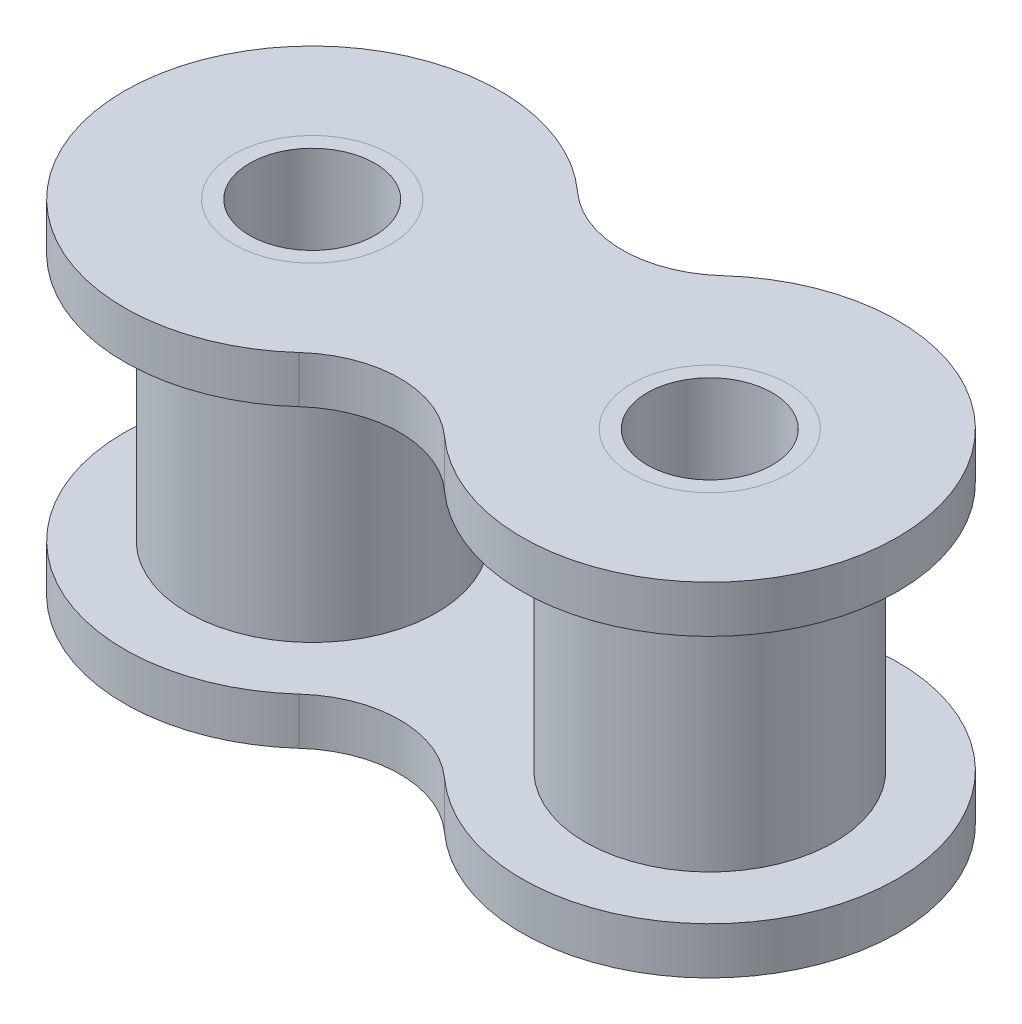
ISO-10303-21;
HEADER;
FILE_DESCRIPTION(('STEP AP214'),'2;1');
FILE_NAME('part.step','',(''),(''),'','','');
FILE_SCHEMA(('AUTOMOTIVE_DESIGN { 1 0 10303 214 1 1 1 1 }'));
ENDSEC;
DATA;
#1=APPLICATION_CONTEXT('core data for automotive mechanical design processes');
#2=APPLICATION_PROTOCOL_DEFINITION('international standard','automotive_design',2000,#1);
#3=PRODUCT_CONTEXT('',#1,'mechanical');
#4=PRODUCT('Part','Part','',(#3));
#5=PRODUCT_RELATED_PRODUCT_CATEGORY('part','',(#4));
#6=PRODUCT_DEFINITION_FORMATION('','',#4);
#7=PRODUCT_DEFINITION_CONTEXT('part definition',#1,'design');
#8=PRODUCT_DEFINITION('design','',#6,#7);
#9=PRODUCT_DEFINITION_SHAPE('','',#8);
#10=(LENGTH_UNIT() NAMED_UNIT(*) SI_UNIT(.MILLI.,.METRE.));
#11=(NAMED_UNIT(*) PLANE_ANGLE_UNIT() SI_UNIT($,.RADIAN.));
#12=(NAMED_UNIT(*) SI_UNIT($,.STERADIAN.) SOLID_ANGLE_UNIT());
#13=UNCERTAINTY_MEASURE_WITH_UNIT(LENGTH_MEASURE(1.E-05),#10,'distance_accuracy_value','');
#14=(GEOMETRIC_REPRESENTATION_CONTEXT(3) GLOBAL_UNCERTAINTY_ASSIGNED_CONTEXT((#13)) GLOBAL_UNIT_ASSIGNED_CONTEXT((#10,
#11,#12)) REPRESENTATION_CONTEXT('',''));
#15=CARTESIAN_POINT('',(0.,0.,0.));
#16=DIRECTION('',(0.,0.,1.));
#17=DIRECTION('',(1.,0.,0.));
#18=AXIS2_PLACEMENT_3D('',#15,#16,#17);
#19=CARTESIAN_POINT('',(8.35,5.475,0.));
#20=DIRECTION('',(0.,1.,0.));
#21=DIRECTION('',(0.,0.,1.));
#22=AXIS2_PLACEMENT_3D('',#19,#20,#21);
#23=PLANE('',#22);
#24=CARTESIAN_POINT('',(6.35,5.475,0.));
#25=DIRECTION('',(0.,1.,0.));
#26=DIRECTION('',(0.,0.,1.));
#27=AXIS2_PLACEMENT_3D('',#24,#25,#26);
#28=CIRCLE('',#27,2.5);
#29=CARTESIAN_POINT('',(6.35,5.475,2.5));
#30=VERTEX_POINT('',#29);
#31=EDGE_CURVE('E11',#30,#30,#28,.T.);
#32=ORIENTED_EDGE('',*,*,#31,.T.);
#33=EDGE_LOOP('',(#32));
#34=FACE_BOUND('',#33,.T.);
#35=CARTESIAN_POINT('',(6.35,5.475,0.));
#36=DIRECTION('',(0.,1.,0.));
#37=DIRECTION('',(0.,0.,1.));
#38=AXIS2_PLACEMENT_3D('',#35,#36,#37);
#39=CIRCLE('',#38,2.);
#40=CARTESIAN_POINT('',(6.35,5.475,2.));
#41=VERTEX_POINT('',#40);
#42=EDGE_CURVE('E60',#41,#41,#39,.T.);
#43=ORIENTED_EDGE('',*,*,#42,.F.);
#44=EDGE_LOOP('',(#43));
#45=FACE_BOUND('',#44,.T.);
#46=ADVANCED_FACE('F46',(#34,#45),#23,.T.);
#47=CARTESIAN_POINT('',(6.35,-5.475,0.));
#48=DIRECTION('',(0.,1.,0.));
#49=DIRECTION('',(0.,0.,1.));
#50=AXIS2_PLACEMENT_3D('',#47,#48,#49);
#51=CYLINDRICAL_SURFACE('',#50,2.5);
#52=CARTESIAN_POINT('',(6.35,-5.475,0.));
#53=DIRECTION('',(0.,1.,0.));
#54=DIRECTION('',(0.,0.,1.));
#55=AXIS2_PLACEMENT_3D('',#52,#53,#54);
#56=CIRCLE('',#55,2.5);
#57=CARTESIAN_POINT('',(6.35,-5.475,2.5));
#58=VERTEX_POINT('',#57);
#59=EDGE_CURVE('E52',#58,#58,#56,.T.);
#60=ORIENTED_EDGE('',*,*,#59,.T.);
#61=EDGE_LOOP('',(#60));
#62=FACE_BOUND('',#61,.T.);
#63=ORIENTED_EDGE('',*,*,#31,.F.);
#64=EDGE_LOOP('',(#63));
#65=FACE_BOUND('',#64,.T.);
#66=ADVANCED_FACE('F70',(#62,#65),#51,.T.);
#67=CARTESIAN_POINT('',(8.85,-5.475,0.));
#68=DIRECTION('',(0.,-1.,0.));
#69=DIRECTION('',(0.,0.,-1.));
#70=AXIS2_PLACEMENT_3D('',#67,#68,#69);
#71=PLANE('',#70);
#72=CARTESIAN_POINT('',(6.35,-5.475,0.));
#73=DIRECTION('',(0.,1.,0.));
#74=DIRECTION('',(0.,0.,1.));
#75=AXIS2_PLACEMENT_3D('',#72,#73,#74);
#76=CIRCLE('',#75,2.);
#77=CARTESIAN_POINT('',(6.35,-5.475,2.));
#78=VERTEX_POINT('',#77);
#79=EDGE_CURVE('E56',#78,#78,#76,.T.);
#80=ORIENTED_EDGE('',*,*,#79,.T.);
#81=EDGE_LOOP('',(#80));
#82=FACE_BOUND('',#81,.T.);
#83=ORIENTED_EDGE('',*,*,#59,.F.);
#84=EDGE_LOOP('',(#83));
#85=FACE_BOUND('',#84,.T.);
#86=ADVANCED_FACE('F74',(#82,#85),#71,.T.);
#87=CARTESIAN_POINT('',(6.35,-5.475,0.));
#88=DIRECTION('',(0.,1.,0.));
#89=DIRECTION('',(0.,0.,1.));
#90=AXIS2_PLACEMENT_3D('',#87,#88,#89);
#91=CYLINDRICAL_SURFACE('',#90,2.);
#92=ORIENTED_EDGE('',*,*,#42,.T.);
#93=EDGE_LOOP('',(#92));
#94=FACE_BOUND('',#93,.T.);
#95=ORIENTED_EDGE('',*,*,#79,.F.);
#96=EDGE_LOOP('',(#95));
#97=FACE_BOUND('',#96,.T.);
#98=ADVANCED_FACE('F66',(#94,#97),#91,.F.);
#99=CLOSED_SHELL('',(#46,#66,#86,#98));
#100=MANIFOLD_SOLID_BREP('B2',#99);
#101=CARTESIAN_POINT('',(-4.35,5.475,0.));
#102=DIRECTION('',(0.,1.,0.));
#103=DIRECTION('',(0.,0.,1.));
#104=AXIS2_PLACEMENT_3D('',#101,#102,#103);
#105=PLANE('',#104);
#106=CARTESIAN_POINT('',(-6.35,5.475,0.));
#107=DIRECTION('',(0.,1.,0.));
#108=DIRECTION('',(0.,0.,1.));
#109=AXIS2_PLACEMENT_3D('',#106,#107,#108);
#110=CIRCLE('',#109,2.5);
#111=CARTESIAN_POINT('',(-6.35,5.475,2.5));
#112=VERTEX_POINT('',#111);
#113=EDGE_CURVE('E45',#112,#112,#110,.T.);
#114=ORIENTED_EDGE('',*,*,#113,.T.);
#115=EDGE_LOOP('',(#114));
#116=FACE_BOUND('',#115,.T.);
#117=CARTESIAN_POINT('',(-6.35,5.475,0.));
#118=DIRECTION('',(0.,1.,0.));
#119=DIRECTION('',(0.,0.,1.));
#120=AXIS2_PLACEMENT_3D('',#117,#118,#119);
#121=CIRCLE('',#120,2.);
#122=CARTESIAN_POINT('',(-6.35,5.475,2.));
#123=VERTEX_POINT('',#122);
#124=EDGE_CURVE('E130',#123,#123,#121,.T.);
#125=ORIENTED_EDGE('',*,*,#124,.F.);
#126=EDGE_LOOP('',(#125));
#127=FACE_BOUND('',#126,.T.);
#128=ADVANCED_FACE('F116',(#116,#127),#105,.T.);
#129=CARTESIAN_POINT('',(-6.35,-5.475,0.));
#130=DIRECTION('',(0.,1.,0.));
#131=DIRECTION('',(0.,0.,1.));
#132=AXIS2_PLACEMENT_3D('',#129,#130,#131);
#133=CYLINDRICAL_SURFACE('',#132,2.5);
#134=CARTESIAN_POINT('',(-6.35,-5.475,0.));
#135=DIRECTION('',(0.,1.,0.));
#136=DIRECTION('',(0.,0.,1.));
#137=AXIS2_PLACEMENT_3D('',#134,#135,#136);
#138=CIRCLE('',#137,2.5);
#139=CARTESIAN_POINT('',(-6.35,-5.475,2.5));
#140=VERTEX_POINT('',#139);
#141=EDGE_CURVE('E122',#140,#140,#138,.T.);
#142=ORIENTED_EDGE('',*,*,#141,.T.);
#143=EDGE_LOOP('',(#142));
#144=FACE_BOUND('',#143,.T.);
#145=ORIENTED_EDGE('',*,*,#113,.F.);
#146=EDGE_LOOP('',(#145));
#147=FACE_BOUND('',#146,.T.);
#148=ADVANCED_FACE('F140',(#144,#147),#133,.T.);
#149=CARTESIAN_POINT('',(-3.85,-5.475,0.));
#150=DIRECTION('',(0.,-1.,0.));
#151=DIRECTION('',(0.,0.,-1.));
#152=AXIS2_PLACEMENT_3D('',#149,#150,#151);
#153=PLANE('',#152);
#154=CARTESIAN_POINT('',(-6.35,-5.475,0.));
#155=DIRECTION('',(0.,1.,0.));
#156=DIRECTION('',(0.,0.,1.));
#157=AXIS2_PLACEMENT_3D('',#154,#155,#156);
#158=CIRCLE('',#157,2.);
#159=CARTESIAN_POINT('',(-6.35,-5.475,2.));
#160=VERTEX_POINT('',#159);
#161=EDGE_CURVE('E126',#160,#160,#158,.T.);
#162=ORIENTED_EDGE('',*,*,#161,.T.);
#163=EDGE_LOOP('',(#162));
#164=FACE_BOUND('',#163,.T.);
#165=ORIENTED_EDGE('',*,*,#141,.F.);
#166=EDGE_LOOP('',(#165));
#167=FACE_BOUND('',#166,.T.);
#168=ADVANCED_FACE('F144',(#164,#167),#153,.T.);
#169=CARTESIAN_POINT('',(-6.35,-5.475,0.));
#170=DIRECTION('',(0.,1.,0.));
#171=DIRECTION('',(0.,0.,1.));
#172=AXIS2_PLACEMENT_3D('',#169,#170,#171);
#173=CYLINDRICAL_SURFACE('',#172,2.);
#174=ORIENTED_EDGE('',*,*,#124,.T.);
#175=EDGE_LOOP('',(#174));
#176=FACE_BOUND('',#175,.T.);
#177=ORIENTED_EDGE('',*,*,#161,.F.);
#178=EDGE_LOOP('',(#177));
#179=FACE_BOUND('',#178,.T.);
#180=ADVANCED_FACE('F136',(#176,#179),#173,.F.);
#181=CLOSED_SHELL('',(#128,#148,#168,#180));
#182=MANIFOLD_SOLID_BREP('B6',#181);
#183=CARTESIAN_POINT('',(6.35,-3.975,0.));
#184=DIRECTION('',(0.,1.,0.));
#185=DIRECTION('',(0.,0.,1.));
#186=AXIS2_PLACEMENT_3D('',#183,#184,#185);
#187=CYLINDRICAL_SURFACE('',#186,3.975);
#188=CARTESIAN_POINT('',(6.35,-3.975,0.));
#189=DIRECTION('',(0.,1.,0.));
#190=DIRECTION('',(0.,0.,1.));
#191=AXIS2_PLACEMENT_3D('',#188,#189,#190);
#192=CIRCLE('',#191,3.975);
#193=CARTESIAN_POINT('',(6.35,-3.975,3.975));
#194=VERTEX_POINT('',#193);
#195=EDGE_CURVE('E115',#194,#194,#192,.T.);
#196=ORIENTED_EDGE('',*,*,#195,.T.);
#197=EDGE_LOOP('',(#196));
#198=FACE_BOUND('',#197,.T.);
#199=CARTESIAN_POINT('',(6.35,3.975,0.));
#200=DIRECTION('',(0.,1.,0.));
#201=DIRECTION('',(0.,0.,1.));
#202=AXIS2_PLACEMENT_3D('',#199,#200,#201);
#203=CIRCLE('',#202,3.975);
#204=CARTESIAN_POINT('',(6.35,3.975,3.975));
#205=VERTEX_POINT('',#204);
#206=EDGE_CURVE('E200',#205,#205,#203,.T.);
#207=ORIENTED_EDGE('',*,*,#206,.F.);
#208=EDGE_LOOP('',(#207));
#209=FACE_BOUND('',#208,.T.);
#210=ADVANCED_FACE('F186',(#198,#209),#187,.T.);
#211=CARTESIAN_POINT('',(10.325,-3.975,0.));
#212=DIRECTION('',(0.,-1.,0.));
#213=DIRECTION('',(0.,0.,-1.));
#214=AXIS2_PLACEMENT_3D('',#211,#212,#213);
#215=PLANE('',#214);
#216=CARTESIAN_POINT('',(6.35,-3.975,0.));
#217=DIRECTION('',(0.,1.,0.));
#218=DIRECTION('',(0.,0.,1.));
#219=AXIS2_PLACEMENT_3D('',#216,#217,#218);
#220=CIRCLE('',#219,2.5);
#221=CARTESIAN_POINT('',(6.35,-3.975,2.5));
#222=VERTEX_POINT('',#221);
#223=EDGE_CURVE('E192',#222,#222,#220,.T.);
#224=ORIENTED_EDGE('',*,*,#223,.T.);
#225=EDGE_LOOP('',(#224));
#226=FACE_BOUND('',#225,.T.);
#227=ORIENTED_EDGE('',*,*,#195,.F.);
#228=EDGE_LOOP('',(#227));
#229=FACE_BOUND('',#228,.T.);
#230=ADVANCED_FACE('F210',(#226,#229),#215,.T.);
#231=CARTESIAN_POINT('',(6.35,-3.975,0.));
#232=DIRECTION('',(0.,1.,0.));
#233=DIRECTION('',(0.,0.,1.));
#234=AXIS2_PLACEMENT_3D('',#231,#232,#233);
#235=CYLINDRICAL_SURFACE('',#234,2.5);
#236=CARTESIAN_POINT('',(6.35,3.975,0.));
#237=DIRECTION('',(0.,1.,0.));
#238=DIRECTION('',(0.,0.,1.));
#239=AXIS2_PLACEMENT_3D('',#236,#237,#238);
#240=CIRCLE('',#239,2.5);
#241=CARTESIAN_POINT('',(6.35,3.975,2.5));
#242=VERTEX_POINT('',#241);
#243=EDGE_CURVE('E196',#242,#242,#240,.T.);
#244=ORIENTED_EDGE('',*,*,#243,.T.);
#245=EDGE_LOOP('',(#244));
#246=FACE_BOUND('',#245,.T.);
#247=ORIENTED_EDGE('',*,*,#223,.F.);
#248=EDGE_LOOP('',(#247));
#249=FACE_BOUND('',#248,.T.);
#250=ADVANCED_FACE('F214',(#246,#249),#235,.F.);
#251=CARTESIAN_POINT('',(8.85,3.975,0.));
#252=DIRECTION('',(0.,1.,0.));
#253=DIRECTION('',(0.,0.,1.));
#254=AXIS2_PLACEMENT_3D('',#251,#252,#253);
#255=PLANE('',#254);
#256=ORIENTED_EDGE('',*,*,#206,.T.);
#257=EDGE_LOOP('',(#256));
#258=FACE_BOUND('',#257,.T.);
#259=ORIENTED_EDGE('',*,*,#243,.F.);
#260=EDGE_LOOP('',(#259));
#261=FACE_BOUND('',#260,.T.);
#262=ADVANCED_FACE('F206',(#258,#261),#255,.T.);
#263=CLOSED_SHELL('',(#210,#230,#250,#262));
#264=MANIFOLD_SOLID_BREP('B40',#263);
#265=CARTESIAN_POINT('',(-3.85,3.975,0.));
#266=DIRECTION('',(0.,1.,0.));
#267=DIRECTION('',(0.,0.,1.));
#268=AXIS2_PLACEMENT_3D('',#265,#266,#267);
#269=PLANE('',#268);
#270=CARTESIAN_POINT('',(-6.35,3.975,0.));
#271=DIRECTION('',(0.,1.,0.));
#272=DIRECTION('',(0.,0.,1.));
#273=AXIS2_PLACEMENT_3D('',#270,#271,#272);
#274=CIRCLE('',#273,3.975);
#275=CARTESIAN_POINT('',(-6.35,3.975,3.975));
#276=VERTEX_POINT('',#275);
#277=EDGE_CURVE('E185',#276,#276,#274,.T.);
#278=ORIENTED_EDGE('',*,*,#277,.T.);
#279=EDGE_LOOP('',(#278));
#280=FACE_BOUND('',#279,.T.);
#281=CARTESIAN_POINT('',(-6.35,3.975,0.));
#282=DIRECTION('',(0.,1.,0.));
#283=DIRECTION('',(0.,0.,1.));
#284=AXIS2_PLACEMENT_3D('',#281,#282,#283);
#285=CIRCLE('',#284,2.5);
#286=CARTESIAN_POINT('',(-6.35,3.975,2.5));
#287=VERTEX_POINT('',#286);
#288=EDGE_CURVE('E272',#287,#287,#285,.T.);
#289=ORIENTED_EDGE('',*,*,#288,.F.);
#290=EDGE_LOOP('',(#289));
#291=FACE_BOUND('',#290,.T.);
#292=ADVANCED_FACE('F258',(#280,#291),#269,.T.);
#293=CARTESIAN_POINT('',(-6.35,-3.975,0.));
#294=DIRECTION('',(0.,1.,0.));
#295=DIRECTION('',(0.,0.,1.));
#296=AXIS2_PLACEMENT_3D('',#293,#294,#295);
#297=CYLINDRICAL_SURFACE('',#296,3.975);
#298=CARTESIAN_POINT('',(-6.35,-3.975,0.));
#299=DIRECTION('',(0.,1.,0.));
#300=DIRECTION('',(0.,0.,1.));
#301=AXIS2_PLACEMENT_3D('',#298,#299,#300);
#302=CIRCLE('',#301,3.975);
#303=CARTESIAN_POINT('',(-6.35,-3.975,3.975));
#304=VERTEX_POINT('',#303);
#305=EDGE_CURVE('E264',#304,#304,#302,.T.);
#306=ORIENTED_EDGE('',*,*,#305,.T.);
#307=EDGE_LOOP('',(#306));
#308=FACE_BOUND('',#307,.T.);
#309=ORIENTED_EDGE('',*,*,#277,.F.);
#310=EDGE_LOOP('',(#309));
#311=FACE_BOUND('',#310,.T.);
#312=ADVANCED_FACE('F282',(#308,#311),#297,.T.);
#313=CARTESIAN_POINT('',(-2.375,-3.975,0.));
#314=DIRECTION('',(0.,-1.,0.));
#315=DIRECTION('',(0.,0.,-1.));
#316=AXIS2_PLACEMENT_3D('',#313,#314,#315);
#317=PLANE('',#316);
#318=CARTESIAN_POINT('',(-6.35,-3.975,0.));
#319=DIRECTION('',(0.,1.,0.));
#320=DIRECTION('',(0.,0.,1.));
#321=AXIS2_PLACEMENT_3D('',#318,#319,#320);
#322=CIRCLE('',#321,2.5);
#323=CARTESIAN_POINT('',(-6.35,-3.975,2.5));
#324=VERTEX_POINT('',#323);
#325=EDGE_CURVE('E268',#324,#324,#322,.T.);
#326=ORIENTED_EDGE('',*,*,#325,.T.);
#327=EDGE_LOOP('',(#326));
#328=FACE_BOUND('',#327,.T.);
#329=ORIENTED_EDGE('',*,*,#305,.F.);
#330=EDGE_LOOP('',(#329));
#331=FACE_BOUND('',#330,.T.);
#332=ADVANCED_FACE('F286',(#328,#331),#317,.T.);
#333=CARTESIAN_POINT('',(-6.35,-3.975,0.));
#334=DIRECTION('',(0.,1.,0.));
#335=DIRECTION('',(0.,0.,1.));
#336=AXIS2_PLACEMENT_3D('',#333,#334,#335);
#337=CYLINDRICAL_SURFACE('',#336,2.5);
#338=ORIENTED_EDGE('',*,*,#288,.T.);
#339=EDGE_LOOP('',(#338));
#340=FACE_BOUND('',#339,.T.);
#341=ORIENTED_EDGE('',*,*,#325,.F.);
#342=EDGE_LOOP('',(#341));
#343=FACE_BOUND('',#342,.T.);
#344=ADVANCED_FACE('F278',(#340,#343),#337,.F.);
#345=CLOSED_SHELL('',(#292,#312,#332,#344));
#346=MANIFOLD_SOLID_BREP('B110',#345);
#347=CARTESIAN_POINT('',(-6.35,-3.975,0.));
#348=DIRECTION('',(0.,-1.,0.));
#349=DIRECTION('',(0.,0.,-1.));
#350=AXIS2_PLACEMENT_3D('',#347,#348,#349);
#351=CYLINDRICAL_SURFACE('',#350,6.);
#352=CARTESIAN_POINT('',(-6.35,-5.475,0.));
#353=DIRECTION('',(0.,-1.,0.));
#354=DIRECTION('',(0.,0.,-1.));
#355=AXIS2_PLACEMENT_3D('',#352,#353,#354);
#356=CIRCLE('',#355,6.);
#357=CARTESIAN_POINT('',(-2.31999460334582,-5.475,4.4451160280625));
#358=VERTEX_POINT('',#357);
#359=CARTESIAN_POINT('',(-2.31999460334582,-5.475,-4.4451160280625));
#360=VERTEX_POINT('',#359);
#361=EDGE_CURVE('E394',#358,#360,#356,.T.);
#362=ORIENTED_EDGE('',*,*,#361,.F.);
#363=DIRECTION('',(0.,-1.,0.));
#364=VECTOR('',#363,1.);
#365=CARTESIAN_POINT('',(-2.31999460334582,-3.975,4.4451160280625));
#366=LINE('',#365,#364);
#367=CARTESIAN_POINT('',(-2.31999460334582,-3.975,4.4451160280625));
#368=VERTEX_POINT('',#367);
#369=EDGE_CURVE('E256',#368,#358,#366,.T.);
#370=ORIENTED_EDGE('',*,*,#369,.F.);
#371=CARTESIAN_POINT('',(-6.35,-3.975,0.));
#372=DIRECTION('',(0.,-1.,0.));
#373=DIRECTION('',(0.,0.,-1.));
#374=AXIS2_PLACEMENT_3D('',#371,#372,#373);
#375=CIRCLE('',#374,6.);
#376=CARTESIAN_POINT('',(-2.31999460334582,-3.975,-4.4451160280625));
#377=VERTEX_POINT('',#376);
#378=EDGE_CURVE('E387',#368,#377,#375,.T.);
#379=ORIENTED_EDGE('',*,*,#378,.T.);
#380=DIRECTION('',(0.,-1.,0.));
#381=VECTOR('',#380,1.);
#382=CARTESIAN_POINT('',(-2.31999460334582,-3.975,-4.4451160280625));
#383=LINE('',#382,#381);
#384=EDGE_CURVE('E332',#377,#360,#383,.T.);
#385=ORIENTED_EDGE('',*,*,#384,.T.);
#386=EDGE_LOOP('',(#362,#370,#379,#385));
#387=FACE_BOUND('',#386,.T.);
#388=ADVANCED_FACE('F329',(#387),#351,.T.);
#389=CARTESIAN_POINT('',(0.,-3.975,7.00408163265271));
#390=DIRECTION('',(0.,-1.,0.));
#391=DIRECTION('',(0.,0.,-1.));
#392=AXIS2_PLACEMENT_3D('',#389,#390,#391);
#393=CYLINDRICAL_SURFACE('',#392,3.4540816326528);
#394=CARTESIAN_POINT('',(0.,-5.475,7.00408163265271));
#395=DIRECTION('',(0.,1.,0.));
#396=DIRECTION('',(0.,0.,1.));
#397=AXIS2_PLACEMENT_3D('',#394,#395,#396);
#398=CIRCLE('',#397,3.4540816326528);
#399=CARTESIAN_POINT('',(2.31999460334581,-5.475,4.4451160280625));
#400=VERTEX_POINT('',#399);
#401=EDGE_CURVE('E389',#400,#358,#398,.T.);
#402=ORIENTED_EDGE('',*,*,#401,.F.);
#403=DIRECTION('',(0.,-1.,0.));
#404=VECTOR('',#403,1.);
#405=CARTESIAN_POINT('',(2.31999460334581,-3.975,4.4451160280625));
#406=LINE('',#405,#404);
#407=CARTESIAN_POINT('',(2.31999460334581,-3.975,4.4451160280625));
#408=VERTEX_POINT('',#407);
#409=EDGE_CURVE('E338',#408,#400,#406,.T.);
#410=ORIENTED_EDGE('',*,*,#409,.F.);
#411=CARTESIAN_POINT('',(0.,-3.975,7.00408163265271));
#412=DIRECTION('',(0.,1.,0.));
#413=DIRECTION('',(0.,0.,1.));
#414=AXIS2_PLACEMENT_3D('',#411,#412,#413);
#415=CIRCLE('',#414,3.4540816326528);
#416=EDGE_CURVE('E384',#408,#368,#415,.T.);
#417=ORIENTED_EDGE('',*,*,#416,.T.);
#418=ORIENTED_EDGE('',*,*,#369,.T.);
#419=EDGE_LOOP('',(#402,#410,#417,#418));
#420=FACE_BOUND('',#419,.T.);
#421=ADVANCED_FACE('F405',(#420),#393,.F.);
#422=CARTESIAN_POINT('',(6.35,-3.975,0.));
#423=DIRECTION('',(0.,-1.,0.));
#424=DIRECTION('',(0.,0.,-1.));
#425=AXIS2_PLACEMENT_3D('',#422,#423,#424);
#426=CYLINDRICAL_SURFACE('',#425,6.);
#427=CARTESIAN_POINT('',(6.35,-5.475,0.));
#428=DIRECTION('',(0.,-1.,0.));
#429=DIRECTION('',(0.,0.,-1.));
#430=AXIS2_PLACEMENT_3D('',#427,#428,#429);
#431=CIRCLE('',#430,6.);
#432=CARTESIAN_POINT('',(2.31999460334581,-5.475,-4.4451160280625));
#433=VERTEX_POINT('',#432);
#434=EDGE_CURVE('E379',#433,#400,#431,.T.);
#435=ORIENTED_EDGE('',*,*,#434,.F.);
#436=DIRECTION('',(0.,-1.,0.));
#437=VECTOR('',#436,1.);
#438=CARTESIAN_POINT('',(2.31999460334581,-3.975,-4.4451160280625));
#439=LINE('',#438,#437);
#440=CARTESIAN_POINT('',(2.31999460334581,-3.975,-4.4451160280625));
#441=VERTEX_POINT('',#440);
#442=EDGE_CURVE('E374',#441,#433,#439,.T.);
#443=ORIENTED_EDGE('',*,*,#442,.F.);
#444=CARTESIAN_POINT('',(6.35,-3.975,0.));
#445=DIRECTION('',(0.,-1.,0.));
#446=DIRECTION('',(0.,0.,-1.));
#447=AXIS2_PLACEMENT_3D('',#444,#445,#446);
#448=CIRCLE('',#447,6.);
#449=EDGE_CURVE('E377',#441,#408,#448,.T.);
#450=ORIENTED_EDGE('',*,*,#449,.T.);
#451=ORIENTED_EDGE('',*,*,#409,.T.);
#452=EDGE_LOOP('',(#435,#443,#450,#451));
#453=FACE_BOUND('',#452,.T.);
#454=ADVANCED_FACE('F376',(#453),#426,.T.);
#455=CARTESIAN_POINT('',(0.,-3.975,-7.00408163265271));
#456=DIRECTION('',(0.,-1.,0.));
#457=DIRECTION('',(0.,0.,-1.));
#458=AXIS2_PLACEMENT_3D('',#455,#456,#457);
#459=CYLINDRICAL_SURFACE('',#458,3.4540816326528);
#460=CARTESIAN_POINT('',(0.,-5.475,-7.00408163265271));
#461=DIRECTION('',(0.,1.,0.));
#462=DIRECTION('',(0.,0.,1.));
#463=AXIS2_PLACEMENT_3D('',#460,#461,#462);
#464=CIRCLE('',#463,3.4540816326528);
#465=EDGE_CURVE('E397',#360,#433,#464,.T.);
#466=ORIENTED_EDGE('',*,*,#465,.F.);
#467=ORIENTED_EDGE('',*,*,#384,.F.);
#468=CARTESIAN_POINT('',(0.,-3.975,-7.00408163265271));
#469=DIRECTION('',(0.,1.,0.));
#470=DIRECTION('',(0.,0.,1.));
#471=AXIS2_PLACEMENT_3D('',#468,#469,#470);
#472=CIRCLE('',#471,3.4540816326528);
#473=EDGE_CURVE('E383',#377,#441,#472,.T.);
#474=ORIENTED_EDGE('',*,*,#473,.T.);
#475=ORIENTED_EDGE('',*,*,#442,.T.);
#476=EDGE_LOOP('',(#466,#467,#474,#475));
#477=FACE_BOUND('',#476,.T.);
#478=ADVANCED_FACE('F386',(#477),#459,.F.);
#479=CARTESIAN_POINT('',(-3.175,-3.975,-3.50204081632635));
#480=DIRECTION('',(0.,-1.,0.));
#481=DIRECTION('',(0.,0.,-1.));
#482=AXIS2_PLACEMENT_3D('',#479,#480,#481);
#483=PLANE('',#482);
#484=CARTESIAN_POINT('',(-6.35,-3.975,0.));
#485=DIRECTION('',(0.,-1.,0.));
#486=DIRECTION('',(0.,0.,-1.));
#487=AXIS2_PLACEMENT_3D('',#484,#485,#486);
#488=CIRCLE('',#487,2.5);
#489=CARTESIAN_POINT('',(-6.35,-3.975,-2.5));
#490=VERTEX_POINT('',#489);
#491=EDGE_CURVE('E438',#490,#490,#488,.T.);
#492=ORIENTED_EDGE('',*,*,#491,.T.);
#493=EDGE_LOOP('',(#492));
#494=FACE_BOUND('',#493,.T.);
#495=CARTESIAN_POINT('',(6.35,-3.975,0.));
#496=DIRECTION('',(0.,-1.,0.));
#497=DIRECTION('',(0.,0.,-1.));
#498=AXIS2_PLACEMENT_3D('',#495,#496,#497);
#499=CIRCLE('',#498,2.5);
#500=CARTESIAN_POINT('',(6.35,-3.975,-2.5));
#501=VERTEX_POINT('',#500);
#502=EDGE_CURVE('E398',#501,#501,#499,.T.);
#503=ORIENTED_EDGE('',*,*,#502,.T.);
#504=EDGE_LOOP('',(#503));
#505=FACE_BOUND('',#504,.T.);
#506=ORIENTED_EDGE('',*,*,#378,.F.);
#507=ORIENTED_EDGE('',*,*,#416,.F.);
#508=ORIENTED_EDGE('',*,*,#449,.F.);
#509=ORIENTED_EDGE('',*,*,#473,.F.);
#510=EDGE_LOOP('',(#506,#507,#508,#509));
#511=FACE_BOUND('',#510,.T.);
#512=ADVANCED_FACE('F382',(#494,#505,#511),#483,.F.);
#513=CARTESIAN_POINT('',(-3.175,-5.475,-3.50204081632635));
#514=DIRECTION('',(0.,-1.,0.));
#515=DIRECTION('',(0.,0.,-1.));
#516=AXIS2_PLACEMENT_3D('',#513,#514,#515);
#517=PLANE('',#516);
#518=CARTESIAN_POINT('',(-6.35,-5.475,0.));
#519=DIRECTION('',(0.,-1.,0.));
#520=DIRECTION('',(0.,0.,-1.));
#521=AXIS2_PLACEMENT_3D('',#518,#519,#520);
#522=CIRCLE('',#521,2.5);
#523=CARTESIAN_POINT('',(-6.35,-5.475,-2.5));
#524=VERTEX_POINT('',#523);
#525=EDGE_CURVE('E441',#524,#524,#522,.T.);
#526=ORIENTED_EDGE('',*,*,#525,.F.);
#527=EDGE_LOOP('',(#526));
#528=FACE_BOUND('',#527,.T.);
#529=CARTESIAN_POINT('',(6.35,-5.475,0.));
#530=DIRECTION('',(0.,-1.,0.));
#531=DIRECTION('',(0.,0.,-1.));
#532=AXIS2_PLACEMENT_3D('',#529,#530,#531);
#533=CIRCLE('',#532,2.5);
#534=CARTESIAN_POINT('',(6.35,-5.475,-2.5));
#535=VERTEX_POINT('',#534);
#536=EDGE_CURVE('E443',#535,#535,#533,.T.);
#537=ORIENTED_EDGE('',*,*,#536,.F.);
#538=EDGE_LOOP('',(#537));
#539=FACE_BOUND('',#538,.T.);
#540=ORIENTED_EDGE('',*,*,#361,.T.);
#541=ORIENTED_EDGE('',*,*,#465,.T.);
#542=ORIENTED_EDGE('',*,*,#434,.T.);
#543=ORIENTED_EDGE('',*,*,#401,.T.);
#544=EDGE_LOOP('',(#540,#541,#542,#543));
#545=FACE_BOUND('',#544,.T.);
#546=ADVANCED_FACE('F404',(#528,#539,#545),#517,.T.);
#547=CARTESIAN_POINT('',(6.35,-3.975,0.));
#548=DIRECTION('',(0.,-1.,0.));
#549=DIRECTION('',(0.,0.,-1.));
#550=AXIS2_PLACEMENT_3D('',#547,#548,#549);
#551=CYLINDRICAL_SURFACE('',#550,2.5);
#552=ORIENTED_EDGE('',*,*,#502,.F.);
#553=EDGE_LOOP('',(#552));
#554=FACE_BOUND('',#553,.T.);
#555=ORIENTED_EDGE('',*,*,#536,.T.);
#556=EDGE_LOOP('',(#555));
#557=FACE_BOUND('',#556,.T.);
#558=ADVANCED_FACE('F423',(#554,#557),#551,.F.);
#559=CARTESIAN_POINT('',(-6.35,-3.975,0.));
#560=DIRECTION('',(0.,-1.,0.));
#561=DIRECTION('',(0.,0.,-1.));
#562=AXIS2_PLACEMENT_3D('',#559,#560,#561);
#563=CYLINDRICAL_SURFACE('',#562,2.5);
#564=ORIENTED_EDGE('',*,*,#491,.F.);
#565=EDGE_LOOP('',(#564));
#566=FACE_BOUND('',#565,.T.);
#567=ORIENTED_EDGE('',*,*,#525,.T.);
#568=EDGE_LOOP('',(#567));
#569=FACE_BOUND('',#568,.T.);
#570=ADVANCED_FACE('F430',(#566,#569),#563,.F.);
#571=CLOSED_SHELL('',(#388,#421,#454,#478,#512,#546,#558,#570));
#572=MANIFOLD_SOLID_BREP('B180',#571);
#573=CARTESIAN_POINT('',(6.35,3.975,0.));
#574=DIRECTION('',(0.,1.,0.));
#575=DIRECTION('',(0.,0.,1.));
#576=AXIS2_PLACEMENT_3D('',#573,#574,#575);
#577=CYLINDRICAL_SURFACE('',#576,6.);
#578=CARTESIAN_POINT('',(6.35,5.475,0.));
#579=DIRECTION('',(0.,1.,0.));
#580=DIRECTION('',(0.,0.,1.));
#581=AXIS2_PLACEMENT_3D('',#578,#579,#580);
#582=CIRCLE('',#581,6.);
#583=CARTESIAN_POINT('',(2.31999460334581,5.475,4.4451160280625));
#584=VERTEX_POINT('',#583);
#585=CARTESIAN_POINT('',(2.31999460334581,5.475,-4.4451160280625));
#586=VERTEX_POINT('',#585);
#587=EDGE_CURVE('E560',#584,#586,#582,.T.);
#588=ORIENTED_EDGE('',*,*,#587,.F.);
#589=DIRECTION('',(0.,1.,0.));
#590=VECTOR('',#589,1.);
#591=CARTESIAN_POINT('',(2.31999460334581,3.975,4.4451160280625));
#592=LINE('',#591,#590);
#593=CARTESIAN_POINT('',(2.31999460334581,3.975,4.4451160280625));
#594=VERTEX_POINT('',#593);
#595=EDGE_CURVE('E327',#594,#584,#592,.T.);
#596=ORIENTED_EDGE('',*,*,#595,.F.);
#597=CARTESIAN_POINT('',(6.35,3.975,0.));
#598=DIRECTION('',(0.,1.,0.));
#599=DIRECTION('',(0.,0.,1.));
#600=AXIS2_PLACEMENT_3D('',#597,#598,#599);
#601=CIRCLE('',#600,6.);
#602=CARTESIAN_POINT('',(2.31999460334581,3.975,-4.4451160280625));
#603=VERTEX_POINT('',#602);
#604=EDGE_CURVE('E553',#594,#603,#601,.T.);
#605=ORIENTED_EDGE('',*,*,#604,.T.);
#606=DIRECTION('',(0.,1.,0.));
#607=VECTOR('',#606,1.);
#608=CARTESIAN_POINT('',(2.31999460334581,3.975,-4.4451160280625));
#609=LINE('',#608,#607);
#610=EDGE_CURVE('E498',#603,#586,#609,.T.);
#611=ORIENTED_EDGE('',*,*,#610,.T.);
#612=EDGE_LOOP('',(#588,#596,#605,#611));
#613=FACE_BOUND('',#612,.T.);
#614=ADVANCED_FACE('F495',(#613),#577,.T.);
#615=CARTESIAN_POINT('',(0.,3.975,7.00408163265271));
#616=DIRECTION('',(0.,1.,0.));
#617=DIRECTION('',(0.,0.,1.));
#618=AXIS2_PLACEMENT_3D('',#615,#616,#617);
#619=CYLINDRICAL_SURFACE('',#618,3.4540816326528);
#620=CARTESIAN_POINT('',(0.,5.475,7.00408163265271));
#621=DIRECTION('',(0.,-1.,0.));
#622=DIRECTION('',(0.,0.,-1.));
#623=AXIS2_PLACEMENT_3D('',#620,#621,#622);
#624=CIRCLE('',#623,3.4540816326528);
#625=CARTESIAN_POINT('',(-2.31999460334582,5.475,4.4451160280625));
#626=VERTEX_POINT('',#625);
#627=EDGE_CURVE('E555',#626,#584,#624,.T.);
#628=ORIENTED_EDGE('',*,*,#627,.F.);
#629=DIRECTION('',(0.,1.,0.));
#630=VECTOR('',#629,1.);
#631=CARTESIAN_POINT('',(-2.31999460334582,3.975,4.4451160280625));
#632=LINE('',#631,#630);
#633=CARTESIAN_POINT('',(-2.31999460334582,3.975,4.4451160280625));
#634=VERTEX_POINT('',#633);
#635=EDGE_CURVE('E504',#634,#626,#632,.T.);
#636=ORIENTED_EDGE('',*,*,#635,.F.);
#637=CARTESIAN_POINT('',(0.,3.975,7.00408163265271));
#638=DIRECTION('',(0.,-1.,0.));
#639=DIRECTION('',(0.,0.,-1.));
#640=AXIS2_PLACEMENT_3D('',#637,#638,#639);
#641=CIRCLE('',#640,3.4540816326528);
#642=EDGE_CURVE('E550',#634,#594,#641,.T.);
#643=ORIENTED_EDGE('',*,*,#642,.T.);
#644=ORIENTED_EDGE('',*,*,#595,.T.);
#645=EDGE_LOOP('',(#628,#636,#643,#644));
#646=FACE_BOUND('',#645,.T.);
#647=ADVANCED_FACE('F571',(#646),#619,.F.);
#648=CARTESIAN_POINT('',(-6.35,3.975,0.));
#649=DIRECTION('',(0.,1.,0.));
#650=DIRECTION('',(0.,0.,1.));
#651=AXIS2_PLACEMENT_3D('',#648,#649,#650);
#652=CYLINDRICAL_SURFACE('',#651,6.);
#653=CARTESIAN_POINT('',(-6.35,5.475,0.));
#654=DIRECTION('',(0.,1.,0.));
#655=DIRECTION('',(0.,0.,1.));
#656=AXIS2_PLACEMENT_3D('',#653,#654,#655);
#657=CIRCLE('',#656,6.);
#658=CARTESIAN_POINT('',(-2.31999460334582,5.475,-4.4451160280625));
#659=VERTEX_POINT('',#658);
#660=EDGE_CURVE('E545',#659,#626,#657,.T.);
#661=ORIENTED_EDGE('',*,*,#660,.F.);
#662=DIRECTION('',(0.,1.,0.));
#663=VECTOR('',#662,1.);
#664=CARTESIAN_POINT('',(-2.31999460334582,3.975,-4.4451160280625));
#665=LINE('',#664,#663);
#666=CARTESIAN_POINT('',(-2.31999460334582,3.975,-4.4451160280625));
#667=VERTEX_POINT('',#666);
#668=EDGE_CURVE('E540',#667,#659,#665,.T.);
#669=ORIENTED_EDGE('',*,*,#668,.F.);
#670=CARTESIAN_POINT('',(-6.35,3.975,0.));
#671=DIRECTION('',(0.,1.,0.));
#672=DIRECTION('',(0.,0.,1.));
#673=AXIS2_PLACEMENT_3D('',#670,#671,#672);
#674=CIRCLE('',#673,6.);
#675=EDGE_CURVE('E543',#667,#634,#674,.T.);
#676=ORIENTED_EDGE('',*,*,#675,.T.);
#677=ORIENTED_EDGE('',*,*,#635,.T.);
#678=EDGE_LOOP('',(#661,#669,#676,#677));
#679=FACE_BOUND('',#678,.T.);
#680=ADVANCED_FACE('F542',(#679),#652,.T.);
#681=CARTESIAN_POINT('',(0.,3.975,-7.00408163265271));
#682=DIRECTION('',(0.,1.,0.));
#683=DIRECTION('',(0.,0.,1.));
#684=AXIS2_PLACEMENT_3D('',#681,#682,#683);
#685=CYLINDRICAL_SURFACE('',#684,3.4540816326528);
#686=CARTESIAN_POINT('',(0.,5.475,-7.00408163265271));
#687=DIRECTION('',(0.,-1.,0.));
#688=DIRECTION('',(0.,0.,-1.));
#689=AXIS2_PLACEMENT_3D('',#686,#687,#688);
#690=CIRCLE('',#689,3.4540816326528);
#691=EDGE_CURVE('E563',#586,#659,#690,.T.);
#692=ORIENTED_EDGE('',*,*,#691,.F.);
#693=ORIENTED_EDGE('',*,*,#610,.F.);
#694=CARTESIAN_POINT('',(0.,3.975,-7.00408163265271));
#695=DIRECTION('',(0.,-1.,0.));
#696=DIRECTION('',(0.,0.,-1.));
#697=AXIS2_PLACEMENT_3D('',#694,#695,#696);
#698=CIRCLE('',#697,3.4540816326528);
#699=EDGE_CURVE('E549',#603,#667,#698,.T.);
#700=ORIENTED_EDGE('',*,*,#699,.T.);
#701=ORIENTED_EDGE('',*,*,#668,.T.);
#702=EDGE_LOOP('',(#692,#693,#700,#701));
#703=FACE_BOUND('',#702,.T.);
#704=ADVANCED_FACE('F552',(#703),#685,.F.);
#705=CARTESIAN_POINT('',(3.175,3.975,-3.50204081632635));
#706=DIRECTION('',(0.,1.,0.));
#707=DIRECTION('',(0.,0.,1.));
#708=AXIS2_PLACEMENT_3D('',#705,#706,#707);
#709=PLANE('',#708);
#710=CARTESIAN_POINT('',(-6.35,3.975,0.));
#711=DIRECTION('',(0.,1.,0.));
#712=DIRECTION('',(0.,0.,1.));
#713=AXIS2_PLACEMENT_3D('',#710,#711,#712);
#714=CIRCLE('',#713,2.5);
#715=CARTESIAN_POINT('',(-6.35,3.975,2.5));
#716=VERTEX_POINT('',#715);
#717=EDGE_CURVE('E604',#716,#716,#714,.T.);
#718=ORIENTED_EDGE('',*,*,#717,.T.);
#719=EDGE_LOOP('',(#718));
#720=FACE_BOUND('',#719,.T.);
#721=CARTESIAN_POINT('',(6.35,3.975,0.));
#722=DIRECTION('',(0.,1.,0.));
#723=DIRECTION('',(0.,0.,1.));
#724=AXIS2_PLACEMENT_3D('',#721,#722,#723);
#725=CIRCLE('',#724,2.5);
#726=CARTESIAN_POINT('',(6.35,3.975,2.5));
#727=VERTEX_POINT('',#726);
#728=EDGE_CURVE('E564',#727,#727,#725,.T.);
#729=ORIENTED_EDGE('',*,*,#728,.T.);
#730=EDGE_LOOP('',(#729));
#731=FACE_BOUND('',#730,.T.);
#732=ORIENTED_EDGE('',*,*,#604,.F.);
#733=ORIENTED_EDGE('',*,*,#642,.F.);
#734=ORIENTED_EDGE('',*,*,#675,.F.);
#735=ORIENTED_EDGE('',*,*,#699,.F.);
#736=EDGE_LOOP('',(#732,#733,#734,#735));
#737=FACE_BOUND('',#736,.T.);
#738=ADVANCED_FACE('F548',(#720,#731,#737),#709,.F.);
#739=CARTESIAN_POINT('',(3.175,5.475,-3.50204081632635));
#740=DIRECTION('',(0.,1.,0.));
#741=DIRECTION('',(0.,0.,1.));
#742=AXIS2_PLACEMENT_3D('',#739,#740,#741);
#743=PLANE('',#742);
#744=CARTESIAN_POINT('',(-6.35,5.475,0.));
#745=DIRECTION('',(0.,1.,0.));
#746=DIRECTION('',(0.,0.,1.));
#747=AXIS2_PLACEMENT_3D('',#744,#745,#746);
#748=CIRCLE('',#747,2.5);
#749=CARTESIAN_POINT('',(-6.35,5.475,2.5));
#750=VERTEX_POINT('',#749);
#751=EDGE_CURVE('E607',#750,#750,#748,.T.);
#752=ORIENTED_EDGE('',*,*,#751,.F.);
#753=EDGE_LOOP('',(#752));
#754=FACE_BOUND('',#753,.T.);
#755=CARTESIAN_POINT('',(6.35,5.475,0.));
#756=DIRECTION('',(0.,1.,0.));
#757=DIRECTION('',(0.,0.,1.));
#758=AXIS2_PLACEMENT_3D('',#755,#756,#757);
#759=CIRCLE('',#758,2.5);
#760=CARTESIAN_POINT('',(6.35,5.475,2.5));
#761=VERTEX_POINT('',#760);
#762=EDGE_CURVE('E609',#761,#761,#759,.T.);
#763=ORIENTED_EDGE('',*,*,#762,.F.);
#764=EDGE_LOOP('',(#763));
#765=FACE_BOUND('',#764,.T.);
#766=ORIENTED_EDGE('',*,*,#587,.T.);
#767=ORIENTED_EDGE('',*,*,#691,.T.);
#768=ORIENTED_EDGE('',*,*,#660,.T.);
#769=ORIENTED_EDGE('',*,*,#627,.T.);
#770=EDGE_LOOP('',(#766,#767,#768,#769));
#771=FACE_BOUND('',#770,.T.);
#772=ADVANCED_FACE('F570',(#754,#765,#771),#743,.T.);
#773=CARTESIAN_POINT('',(6.35,3.975,0.));
#774=DIRECTION('',(0.,1.,0.));
#775=DIRECTION('',(0.,0.,1.));
#776=AXIS2_PLACEMENT_3D('',#773,#774,#775);
#777=CYLINDRICAL_SURFACE('',#776,2.5);
#778=ORIENTED_EDGE('',*,*,#728,.F.);
#779=EDGE_LOOP('',(#778));
#780=FACE_BOUND('',#779,.T.);
#781=ORIENTED_EDGE('',*,*,#762,.T.);
#782=EDGE_LOOP('',(#781));
#783=FACE_BOUND('',#782,.T.);
#784=ADVANCED_FACE('F589',(#780,#783),#777,.F.);
#785=CARTESIAN_POINT('',(-6.35,3.975,0.));
#786=DIRECTION('',(0.,1.,0.));
#787=DIRECTION('',(0.,0.,1.));
#788=AXIS2_PLACEMENT_3D('',#785,#786,#787);
#789=CYLINDRICAL_SURFACE('',#788,2.5);
#790=ORIENTED_EDGE('',*,*,#717,.F.);
#791=EDGE_LOOP('',(#790));
#792=FACE_BOUND('',#791,.T.);
#793=ORIENTED_EDGE('',*,*,#751,.T.);
#794=EDGE_LOOP('',(#793));
#795=FACE_BOUND('',#794,.T.);
#796=ADVANCED_FACE('F596',(#792,#795),#789,.F.);
#797=CLOSED_SHELL('',(#614,#647,#680,#704,#738,#772,#784,#796));
#798=MANIFOLD_SOLID_BREP('B250',#797);
#799=ADVANCED_BREP_SHAPE_REPRESENTATION('',(#18,#100,#182,#264,#346,#572,#798),#14);
#800=SHAPE_DEFINITION_REPRESENTATION(#9,#799);
ENDSEC;
END-ISO-10303-21;
